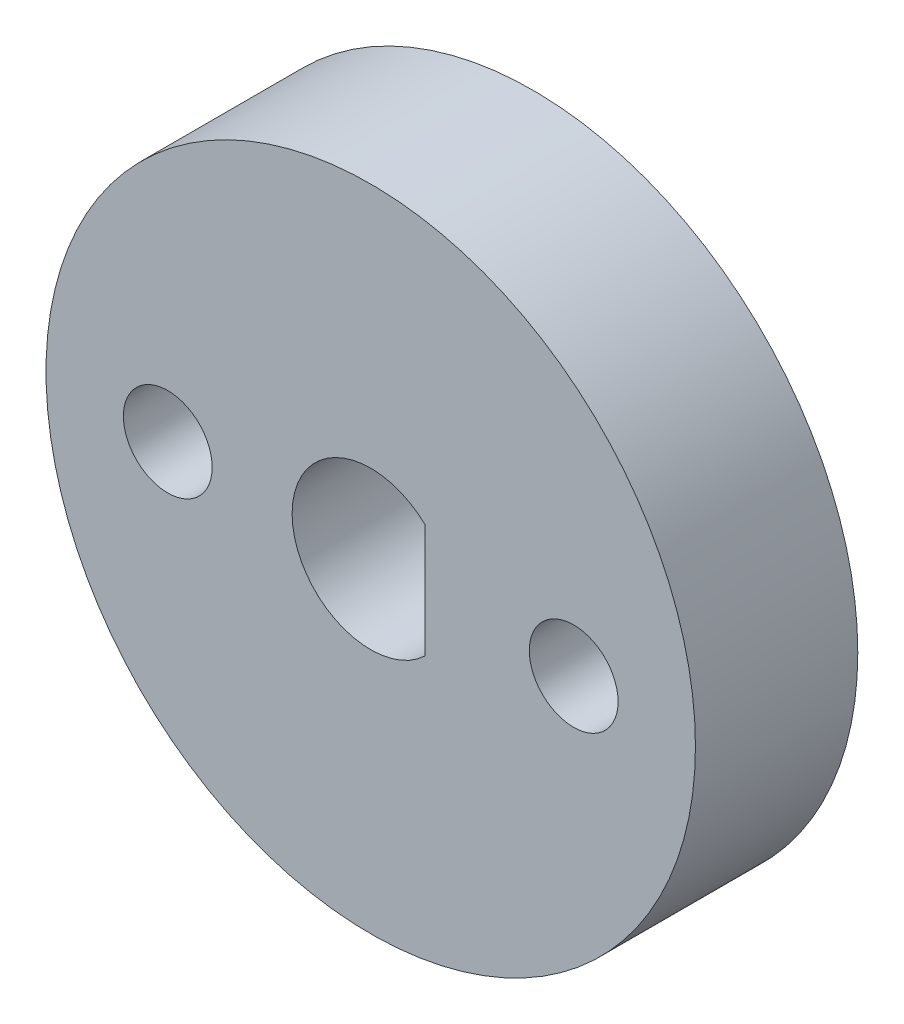
ISO-10303-21;
HEADER;
FILE_DESCRIPTION(('STEP AP214'),'2;1');
FILE_NAME('part.step','',(''),(''),'','','');
FILE_SCHEMA(('AUTOMOTIVE_DESIGN { 1 0 10303 214 1 1 1 1 }'));
ENDSEC;
DATA;
#1=APPLICATION_CONTEXT('core data for automotive mechanical design processes');
#2=APPLICATION_PROTOCOL_DEFINITION('international standard','automotive_design',2000,#1);
#3=PRODUCT_CONTEXT('',#1,'mechanical');
#4=PRODUCT('Part','Part','',(#3));
#5=PRODUCT_RELATED_PRODUCT_CATEGORY('part','',(#4));
#6=PRODUCT_DEFINITION_FORMATION('','',#4);
#7=PRODUCT_DEFINITION_CONTEXT('part definition',#1,'design');
#8=PRODUCT_DEFINITION('design','',#6,#7);
#9=PRODUCT_DEFINITION_SHAPE('','',#8);
#10=(LENGTH_UNIT() NAMED_UNIT(*) SI_UNIT(.MILLI.,.METRE.));
#11=(NAMED_UNIT(*) PLANE_ANGLE_UNIT() SI_UNIT($,.RADIAN.));
#12=(NAMED_UNIT(*) SI_UNIT($,.STERADIAN.) SOLID_ANGLE_UNIT());
#13=UNCERTAINTY_MEASURE_WITH_UNIT(LENGTH_MEASURE(1.E-05),#10,'distance_accuracy_value','');
#14=(GEOMETRIC_REPRESENTATION_CONTEXT(3) GLOBAL_UNCERTAINTY_ASSIGNED_CONTEXT((#13)) GLOBAL_UNIT_ASSIGNED_CONTEXT((#10,
#11,#12)) REPRESENTATION_CONTEXT('',''));
#15=CARTESIAN_POINT('',(0.,0.,0.));
#16=DIRECTION('',(0.,0.,1.));
#17=DIRECTION('',(1.,0.,0.));
#18=AXIS2_PLACEMENT_3D('',#15,#16,#17);
#19=CARTESIAN_POINT('',(0.,0.,6.35));
#20=DIRECTION('',(0.,0.,-1.));
#21=DIRECTION('',(-1.,0.,0.));
#22=AXIS2_PLACEMENT_3D('',#19,#20,#21);
#23=CYLINDRICAL_SURFACE('',#22,3.075);
#24=CARTESIAN_POINT('',(0.,0.,0.));
#25=DIRECTION('',(0.,0.,1.));
#26=DIRECTION('',(1.,0.,0.));
#27=AXIS2_PLACEMENT_3D('',#24,#25,#26);
#28=CIRCLE('',#27,3.075);
#29=CARTESIAN_POINT('',(2.1225,2.22499859550517,0.));
#30=VERTEX_POINT('',#29);
#31=CARTESIAN_POINT('',(2.1225,-2.22499859550517,0.));
#32=VERTEX_POINT('',#31);
#33=EDGE_CURVE('E63',#30,#32,#28,.T.);
#34=ORIENTED_EDGE('',*,*,#33,.F.);
#35=DIRECTION('',(0.,0.,-1.));
#36=VECTOR('',#35,1.);
#37=CARTESIAN_POINT('',(2.1225,2.22499859550517,6.35));
#38=LINE('',#37,#36);
#39=CARTESIAN_POINT('',(2.1225,2.22499859550517,6.35));
#40=VERTEX_POINT('',#39);
#41=EDGE_CURVE('E11',#40,#30,#38,.T.);
#42=ORIENTED_EDGE('',*,*,#41,.F.);
#43=CARTESIAN_POINT('',(0.,0.,6.35));
#44=DIRECTION('',(0.,0.,1.));
#45=DIRECTION('',(1.,0.,0.));
#46=AXIS2_PLACEMENT_3D('',#43,#44,#45);
#47=CIRCLE('',#46,3.075);
#48=CARTESIAN_POINT('',(2.1225,-2.22499859550517,6.35));
#49=VERTEX_POINT('',#48);
#50=EDGE_CURVE('E64',#40,#49,#47,.T.);
#51=ORIENTED_EDGE('',*,*,#50,.T.);
#52=DIRECTION('',(0.,0.,-1.));
#53=VECTOR('',#52,1.);
#54=CARTESIAN_POINT('',(2.1225,-2.22499859550517,6.35));
#55=LINE('',#54,#53);
#56=EDGE_CURVE('E43',#49,#32,#55,.T.);
#57=ORIENTED_EDGE('',*,*,#56,.T.);
#58=EDGE_LOOP('',(#34,#42,#51,#57));
#59=FACE_BOUND('',#58,.T.);
#60=ADVANCED_FACE('F34',(#59),#23,.F.);
#61=CARTESIAN_POINT('',(0.,0.,6.35));
#62=DIRECTION('',(0.,0.,-1.));
#63=DIRECTION('',(-1.,0.,0.));
#64=AXIS2_PLACEMENT_3D('',#61,#62,#63);
#65=CYLINDRICAL_SURFACE('',#64,12.7);
#66=CARTESIAN_POINT('',(0.,0.,6.35));
#67=DIRECTION('',(0.,0.,1.));
#68=DIRECTION('',(1.,0.,0.));
#69=AXIS2_PLACEMENT_3D('',#66,#67,#68);
#70=CIRCLE('',#69,12.7);
#71=CARTESIAN_POINT('',(12.7,0.,6.35));
#72=VERTEX_POINT('',#71);
#73=EDGE_CURVE('E68',#72,#72,#70,.T.);
#74=ORIENTED_EDGE('',*,*,#73,.F.);
#75=EDGE_LOOP('',(#74));
#76=FACE_BOUND('',#75,.T.);
#77=CARTESIAN_POINT('',(0.,0.,0.));
#78=DIRECTION('',(0.,0.,1.));
#79=DIRECTION('',(1.,0.,0.));
#80=AXIS2_PLACEMENT_3D('',#77,#78,#79);
#81=CIRCLE('',#80,12.7);
#82=CARTESIAN_POINT('',(12.7,0.,0.));
#83=VERTEX_POINT('',#82);
#84=EDGE_CURVE('E71',#83,#83,#81,.T.);
#85=ORIENTED_EDGE('',*,*,#84,.T.);
#86=EDGE_LOOP('',(#85));
#87=FACE_BOUND('',#86,.T.);
#88=ADVANCED_FACE('F36',(#76,#87),#65,.T.);
#89=CARTESIAN_POINT('',(2.1225,0.,6.35));
#90=DIRECTION('',(1.,0.,0.));
#91=DIRECTION('',(0.,1.,0.));
#92=AXIS2_PLACEMENT_3D('',#89,#90,#91);
#93=PLANE('',#92);
#94=DIRECTION('',(0.,-1.,0.));
#95=VECTOR('',#94,1.);
#96=CARTESIAN_POINT('',(2.1225,0.,0.));
#97=LINE('',#96,#95);
#98=EDGE_CURVE('E65',#30,#32,#97,.T.);
#99=ORIENTED_EDGE('',*,*,#98,.T.);
#100=ORIENTED_EDGE('',*,*,#56,.F.);
#101=DIRECTION('',(0.,-1.,0.));
#102=VECTOR('',#101,1.);
#103=CARTESIAN_POINT('',(2.1225,0.,6.35));
#104=LINE('',#103,#102);
#105=EDGE_CURVE('E50',#40,#49,#104,.T.);
#106=ORIENTED_EDGE('',*,*,#105,.F.);
#107=ORIENTED_EDGE('',*,*,#41,.T.);
#108=EDGE_LOOP('',(#99,#100,#106,#107));
#109=FACE_BOUND('',#108,.T.);
#110=ADVANCED_FACE('F66',(#109),#93,.F.);
#111=CARTESIAN_POINT('',(0.,0.,6.35));
#112=DIRECTION('',(0.,0.,1.));
#113=DIRECTION('',(1.,0.,0.));
#114=AXIS2_PLACEMENT_3D('',#111,#112,#113);
#115=PLANE('',#114);
#116=CARTESIAN_POINT('',(7.9375,0.,6.35));
#117=DIRECTION('',(0.,0.,1.));
#118=DIRECTION('',(1.,0.,0.));
#119=AXIS2_PLACEMENT_3D('',#116,#117,#118);
#120=CIRCLE('',#119,1.7359375);
#121=CARTESIAN_POINT('',(9.6734375,0.,6.35));
#122=VERTEX_POINT('',#121);
#123=EDGE_CURVE('E74',#122,#122,#120,.T.);
#124=ORIENTED_EDGE('',*,*,#123,.F.);
#125=EDGE_LOOP('',(#124));
#126=FACE_BOUND('',#125,.T.);
#127=CARTESIAN_POINT('',(-7.9375,0.,6.35));
#128=DIRECTION('',(0.,0.,1.));
#129=DIRECTION('',(1.,0.,0.));
#130=AXIS2_PLACEMENT_3D('',#127,#128,#129);
#131=CIRCLE('',#130,1.7359375);
#132=CARTESIAN_POINT('',(-6.2015625,0.,6.35));
#133=VERTEX_POINT('',#132);
#134=EDGE_CURVE('E83',#133,#133,#131,.T.);
#135=ORIENTED_EDGE('',*,*,#134,.F.);
#136=EDGE_LOOP('',(#135));
#137=FACE_BOUND('',#136,.T.);
#138=ORIENTED_EDGE('',*,*,#73,.T.);
#139=EDGE_LOOP('',(#138));
#140=FACE_BOUND('',#139,.T.);
#141=ORIENTED_EDGE('',*,*,#50,.F.);
#142=ORIENTED_EDGE('',*,*,#105,.T.);
#143=EDGE_LOOP('',(#141,#142));
#144=FACE_BOUND('',#143,.T.);
#145=ADVANCED_FACE('F113',(#126,#137,#140,#144),#115,.T.);
#146=CARTESIAN_POINT('',(0.,0.,0.));
#147=DIRECTION('',(0.,0.,1.));
#148=DIRECTION('',(1.,0.,0.));
#149=AXIS2_PLACEMENT_3D('',#146,#147,#148);
#150=PLANE('',#149);
#151=CARTESIAN_POINT('',(7.9375,0.,0.));
#152=DIRECTION('',(0.,0.,1.));
#153=DIRECTION('',(1.,0.,0.));
#154=AXIS2_PLACEMENT_3D('',#151,#152,#153);
#155=CIRCLE('',#154,1.7359375);
#156=CARTESIAN_POINT('',(9.6734375,0.,0.));
#157=VERTEX_POINT('',#156);
#158=EDGE_CURVE('E86',#157,#157,#155,.T.);
#159=ORIENTED_EDGE('',*,*,#158,.T.);
#160=EDGE_LOOP('',(#159));
#161=FACE_BOUND('',#160,.T.);
#162=CARTESIAN_POINT('',(-7.9375,0.,0.));
#163=DIRECTION('',(0.,0.,1.));
#164=DIRECTION('',(1.,0.,0.));
#165=AXIS2_PLACEMENT_3D('',#162,#163,#164);
#166=CIRCLE('',#165,1.7359375);
#167=CARTESIAN_POINT('',(-6.2015625,0.,0.));
#168=VERTEX_POINT('',#167);
#169=EDGE_CURVE('E87',#168,#168,#166,.T.);
#170=ORIENTED_EDGE('',*,*,#169,.T.);
#171=EDGE_LOOP('',(#170));
#172=FACE_BOUND('',#171,.T.);
#173=ORIENTED_EDGE('',*,*,#84,.F.);
#174=EDGE_LOOP('',(#173));
#175=FACE_BOUND('',#174,.T.);
#176=ORIENTED_EDGE('',*,*,#33,.T.);
#177=ORIENTED_EDGE('',*,*,#98,.F.);
#178=EDGE_LOOP('',(#176,#177));
#179=FACE_BOUND('',#178,.T.);
#180=ADVANCED_FACE('F70',(#161,#172,#175,#179),#150,.F.);
#181=CARTESIAN_POINT('',(-7.9375,0.,0.));
#182=DIRECTION('',(0.,0.,1.));
#183=DIRECTION('',(1.,0.,0.));
#184=AXIS2_PLACEMENT_3D('',#181,#182,#183);
#185=CYLINDRICAL_SURFACE('',#184,1.7359375);
#186=ORIENTED_EDGE('',*,*,#134,.T.);
#187=EDGE_LOOP('',(#186));
#188=FACE_BOUND('',#187,.T.);
#189=ORIENTED_EDGE('',*,*,#169,.F.);
#190=EDGE_LOOP('',(#189));
#191=FACE_BOUND('',#190,.T.);
#192=ADVANCED_FACE('F97',(#188,#191),#185,.F.);
#193=CARTESIAN_POINT('',(7.9375,0.,0.));
#194=DIRECTION('',(0.,0.,1.));
#195=DIRECTION('',(1.,0.,0.));
#196=AXIS2_PLACEMENT_3D('',#193,#194,#195);
#197=CYLINDRICAL_SURFACE('',#196,1.7359375);
#198=ORIENTED_EDGE('',*,*,#123,.T.);
#199=EDGE_LOOP('',(#198));
#200=FACE_BOUND('',#199,.T.);
#201=ORIENTED_EDGE('',*,*,#158,.F.);
#202=EDGE_LOOP('',(#201));
#203=FACE_BOUND('',#202,.T.);
#204=ADVANCED_FACE('F95',(#200,#203),#197,.F.);
#205=CLOSED_SHELL('',(#60,#88,#110,#145,#180,#192,#204));
#206=MANIFOLD_SOLID_BREP('B2',#205);
#207=ADVANCED_BREP_SHAPE_REPRESENTATION('',(#18,#206),#14);
#208=SHAPE_DEFINITION_REPRESENTATION(#9,#207);
ENDSEC;
END-ISO-10303-21;
